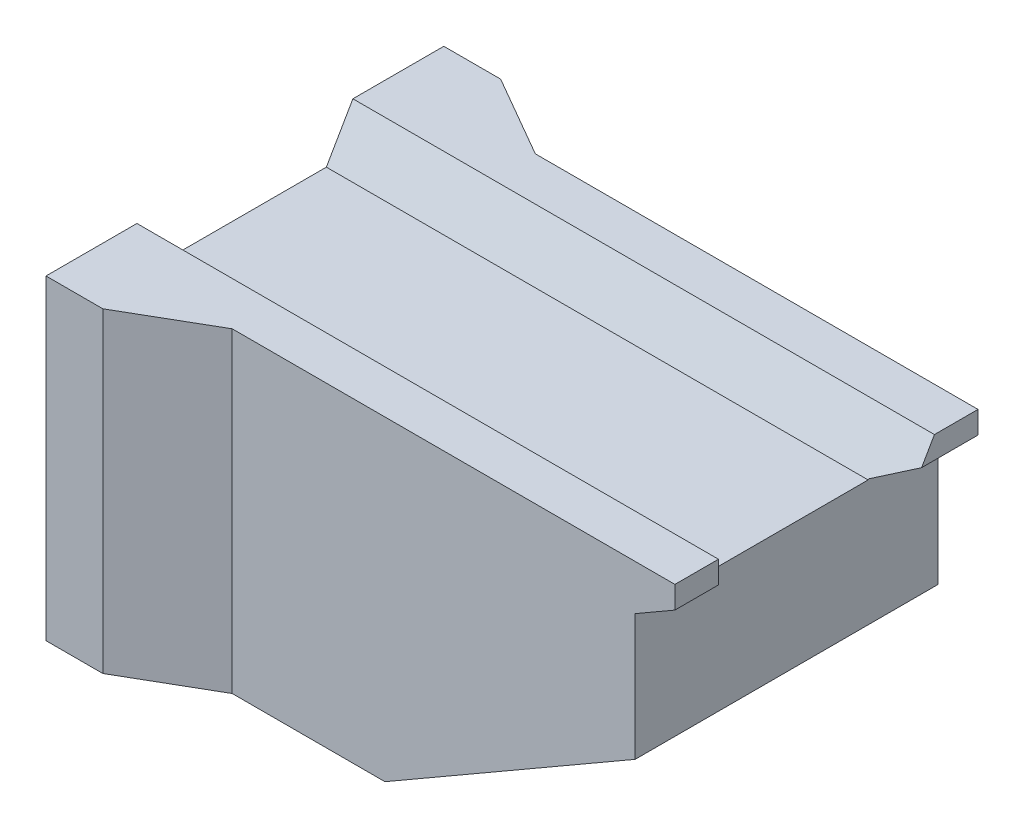
ISO-10303-21;
HEADER;
FILE_DESCRIPTION(('STEP AP214'),'2;1');
FILE_NAME('part.step','',(''),(''),'','','');
FILE_SCHEMA(('AUTOMOTIVE_DESIGN { 1 0 10303 214 1 1 1 1 }'));
ENDSEC;
DATA;
#1=APPLICATION_CONTEXT('core data for automotive mechanical design processes');
#2=APPLICATION_PROTOCOL_DEFINITION('international standard','automotive_design',2000,#1);
#3=PRODUCT_CONTEXT('',#1,'mechanical');
#4=PRODUCT('Part','Part','',(#3));
#5=PRODUCT_RELATED_PRODUCT_CATEGORY('part','',(#4));
#6=PRODUCT_DEFINITION_FORMATION('','',#4);
#7=PRODUCT_DEFINITION_CONTEXT('part definition',#1,'design');
#8=PRODUCT_DEFINITION('design','',#6,#7);
#9=PRODUCT_DEFINITION_SHAPE('','',#8);
#10=(LENGTH_UNIT() NAMED_UNIT(*) SI_UNIT(.MILLI.,.METRE.));
#11=(NAMED_UNIT(*) PLANE_ANGLE_UNIT() SI_UNIT($,.RADIAN.));
#12=(NAMED_UNIT(*) SI_UNIT($,.STERADIAN.) SOLID_ANGLE_UNIT());
#13=UNCERTAINTY_MEASURE_WITH_UNIT(LENGTH_MEASURE(1.E-05),#10,'distance_accuracy_value','');
#14=(GEOMETRIC_REPRESENTATION_CONTEXT(3) GLOBAL_UNCERTAINTY_ASSIGNED_CONTEXT((#13)) GLOBAL_UNIT_ASSIGNED_CONTEXT((#10,
#11,#12)) REPRESENTATION_CONTEXT('',''));
#15=CARTESIAN_POINT('',(0.,0.,0.));
#16=DIRECTION('',(0.,0.,1.));
#17=DIRECTION('',(1.,0.,0.));
#18=AXIS2_PLACEMENT_3D('',#15,#16,#17);
#19=CARTESIAN_POINT('',(350.,-760.,755.));
#20=DIRECTION('',(0.,1.,0.));
#21=DIRECTION('',(0.,0.,1.));
#22=AXIS2_PLACEMENT_3D('',#19,#20,#21);
#23=PLANE('',#22);
#24=DIRECTION('',(0.,0.,1.));
#25=VECTOR('',#24,1.);
#26=CARTESIAN_POINT('',(-264.,-760.,755.));
#27=LINE('',#26,#25);
#28=CARTESIAN_POINT('',(-264.,-760.,527.));
#29=VERTEX_POINT('',#28);
#30=CARTESIAN_POINT('',(-264.,-760.,335.));
#31=VERTEX_POINT('',#30);
#32=EDGE_CURVE('E195',#29,#31,#27,.F.);
#33=ORIENTED_EDGE('',*,*,#32,.F.);
#34=DIRECTION('',(1.,0.,0.));
#35=VECTOR('',#34,1.);
#36=CARTESIAN_POINT('',(350.,-760.,527.));
#37=LINE('',#36,#35);
#38=CARTESIAN_POINT('',(964.,-760.,527.));
#39=VERTEX_POINT('',#38);
#40=EDGE_CURVE('E218',#29,#39,#37,.T.);
#41=ORIENTED_EDGE('',*,*,#40,.T.);
#42=DIRECTION('',(0.,0.,1.));
#43=VECTOR('',#42,1.);
#44=CARTESIAN_POINT('',(964.,-760.,755.));
#45=LINE('',#44,#43);
#46=CARTESIAN_POINT('',(964.,-760.,435.));
#47=VERTEX_POINT('',#46);
#48=EDGE_CURVE('E181',#47,#39,#45,.T.);
#49=ORIENTED_EDGE('',*,*,#48,.F.);
#50=DIRECTION('',(1.,0.,0.));
#51=VECTOR('',#50,1.);
#52=CARTESIAN_POINT('',(496.602540378445,-760.,435.));
#53=LINE('',#52,#51);
#54=CARTESIAN_POINT('',(29.2050807568899,-760.,435.));
#55=VERTEX_POINT('',#54);
#56=EDGE_CURVE('E193',#55,#47,#53,.T.);
#57=ORIENTED_EDGE('',*,*,#56,.F.);
#58=DIRECTION('',(-0.866025403784442,0.,-0.5));
#59=VECTOR('',#58,1.);
#60=CARTESIAN_POINT('',(-57.3974596215552,-760.,385.));
#61=LINE('',#60,#59);
#62=CARTESIAN_POINT('',(-144.,-760.,335.));
#63=VERTEX_POINT('',#62);
#64=EDGE_CURVE('E186',#63,#55,#61,.F.);
#65=ORIENTED_EDGE('',*,*,#64,.F.);
#66=DIRECTION('',(1.,0.,0.));
#67=VECTOR('',#66,1.);
#68=CARTESIAN_POINT('',(-204.,-760.,335.));
#69=LINE('',#68,#67);
#70=EDGE_CURVE('E171',#31,#63,#69,.T.);
#71=ORIENTED_EDGE('',*,*,#70,.F.);
#72=EDGE_LOOP('',(#33,#41,#49,#57,#65,#71));
#73=FACE_BOUND('',#72,.T.);
#74=ADVANCED_FACE('F18',(#73),#23,.T.);
#75=CARTESIAN_POINT('',(964.,-783.5,755.));
#76=DIRECTION('',(1.,0.,0.));
#77=DIRECTION('',(0.,1.,0.));
#78=AXIS2_PLACEMENT_3D('',#75,#76,#77);
#79=PLANE('',#78);
#80=DIRECTION('',(0.,-0.866025403784453,0.499999999999975));
#81=VECTOR('',#80,1.);
#82=CARTESIAN_POINT('',(964.,-760.,527.));
#83=LINE('',#82,#81);
#84=CARTESIAN_POINT('',(964.,-807.,554.135462651908));
#85=VERTEX_POINT('',#84);
#86=EDGE_CURVE('E222',#39,#85,#83,.T.);
#87=ORIENTED_EDGE('',*,*,#86,.T.);
#88=DIRECTION('',(0.,0.,1.));
#89=VECTOR('',#88,1.);
#90=CARTESIAN_POINT('',(964.,-807.,755.));
#91=LINE('',#90,#89);
#92=CARTESIAN_POINT('',(964.,-807.,435.));
#93=VERTEX_POINT('',#92);
#94=EDGE_CURVE('E236',#85,#93,#91,.F.);
#95=ORIENTED_EDGE('',*,*,#94,.T.);
#96=DIRECTION('',(0.,1.,0.));
#97=VECTOR('',#96,1.);
#98=CARTESIAN_POINT('',(964.,-1093.5,435.));
#99=LINE('',#98,#97);
#100=EDGE_CURVE('E245',#47,#93,#99,.F.);
#101=ORIENTED_EDGE('',*,*,#100,.F.);
#102=ORIENTED_EDGE('',*,*,#48,.T.);
#103=EDGE_LOOP('',(#87,#95,#101,#102));
#104=FACE_BOUND('',#103,.T.);
#105=ADVANCED_FACE('F449',(#104),#79,.T.);
#106=CARTESIAN_POINT('',(-204.,-1093.5,335.));
#107=DIRECTION('',(0.,0.,-1.));
#108=DIRECTION('',(0.,1.,0.));
#109=AXIS2_PLACEMENT_3D('',#106,#107,#108);
#110=PLANE('',#109);
#111=DIRECTION('',(0.,-1.,0.));
#112=VECTOR('',#111,1.);
#113=CARTESIAN_POINT('',(-264.,-1093.5,335.));
#114=LINE('',#113,#112);
#115=CARTESIAN_POINT('',(-264.,-1427.,335.));
#116=VERTEX_POINT('',#115);
#117=EDGE_CURVE('E177',#31,#116,#114,.T.);
#118=ORIENTED_EDGE('',*,*,#117,.F.);
#119=ORIENTED_EDGE('',*,*,#70,.T.);
#120=DIRECTION('',(0.,1.,0.));
#121=VECTOR('',#120,1.);
#122=CARTESIAN_POINT('',(-144.,-1093.5,335.));
#123=LINE('',#122,#121);
#124=CARTESIAN_POINT('',(-144.,-1427.,335.));
#125=VERTEX_POINT('',#124);
#126=EDGE_CURVE('E175',#125,#63,#123,.T.);
#127=ORIENTED_EDGE('',*,*,#126,.F.);
#128=DIRECTION('',(1.,0.,0.));
#129=VECTOR('',#128,1.);
#130=CARTESIAN_POINT('',(43.8622518457498,-1427.,335.));
#131=LINE('',#130,#129);
#132=EDGE_CURVE('E270',#116,#125,#131,.T.);
#133=ORIENTED_EDGE('',*,*,#132,.F.);
#134=EDGE_LOOP('',(#118,#119,#127,#133));
#135=FACE_BOUND('',#134,.T.);
#136=ADVANCED_FACE('F173',(#135),#110,.T.);
#137=CARTESIAN_POINT('',(-57.3974596215552,-1093.5,385.));
#138=DIRECTION('',(0.5,0.,-0.866025403784442));
#139=DIRECTION('',(-0.866025403784442,0.,-0.5));
#140=AXIS2_PLACEMENT_3D('',#137,#138,#139);
#141=PLANE('',#140);
#142=ORIENTED_EDGE('',*,*,#64,.T.);
#143=DIRECTION('',(0.,1.,0.));
#144=VECTOR('',#143,1.);
#145=CARTESIAN_POINT('',(29.2050807568898,-1093.5,435.));
#146=LINE('',#145,#144);
#147=CARTESIAN_POINT('',(29.2050807568897,-1427.,435.));
#148=VERTEX_POINT('',#147);
#149=EDGE_CURVE('E240',#148,#55,#146,.T.);
#150=ORIENTED_EDGE('',*,*,#149,.F.);
#151=DIRECTION('',(0.866025403784441,0.,0.5));
#152=VECTOR('',#151,1.);
#153=CARTESIAN_POINT('',(-144.,-1427.,335.));
#154=LINE('',#153,#152);
#155=EDGE_CURVE('E188',#125,#148,#154,.T.);
#156=ORIENTED_EDGE('',*,*,#155,.F.);
#157=ORIENTED_EDGE('',*,*,#126,.T.);
#158=EDGE_LOOP('',(#142,#150,#156,#157));
#159=FACE_BOUND('',#158,.T.);
#160=ADVANCED_FACE('F184',(#159),#141,.T.);
#161=CARTESIAN_POINT('',(-264.,-1093.5,755.));
#162=DIRECTION('',(-1.,0.,0.));
#163=DIRECTION('',(0.,-1.,0.));
#164=AXIS2_PLACEMENT_3D('',#161,#162,#163);
#165=PLANE('',#164);
#166=DIRECTION('',(0.,0.,1.));
#167=VECTOR('',#166,1.);
#168=CARTESIAN_POINT('',(-264.,-760.,755.));
#169=LINE('',#168,#167);
#170=CARTESIAN_POINT('',(-264.,-760.,983.));
#171=VERTEX_POINT('',#170);
#172=CARTESIAN_POINT('',(-264.,-760.,1175.));
#173=VERTEX_POINT('',#172);
#174=EDGE_CURVE('E278',#171,#173,#169,.T.);
#175=ORIENTED_EDGE('',*,*,#174,.F.);
#176=DIRECTION('',(0.,-1.,0.));
#177=VECTOR('',#176,1.);
#178=CARTESIAN_POINT('',(-264.,-1093.5,983.));
#179=LINE('',#178,#177);
#180=CARTESIAN_POINT('',(-264.,-857.,983.));
#181=VERTEX_POINT('',#180);
#182=EDGE_CURVE('E207',#171,#181,#179,.T.);
#183=ORIENTED_EDGE('',*,*,#182,.T.);
#184=DIRECTION('',(0.,0.,1.));
#185=VECTOR('',#184,1.);
#186=CARTESIAN_POINT('',(-264.,-857.,755.));
#187=LINE('',#186,#185);
#188=CARTESIAN_POINT('',(-264.,-857.,583.00297611139));
#189=VERTEX_POINT('',#188);
#190=EDGE_CURVE('E211',#181,#189,#187,.F.);
#191=ORIENTED_EDGE('',*,*,#190,.T.);
#192=DIRECTION('',(0.,0.866025403784453,-0.499999999999975));
#193=VECTOR('',#192,1.);
#194=CARTESIAN_POINT('',(-264.,-857.,583.00297611139));
#195=LINE('',#194,#193);
#196=EDGE_CURVE('E223',#189,#29,#195,.T.);
#197=ORIENTED_EDGE('',*,*,#196,.T.);
#198=ORIENTED_EDGE('',*,*,#32,.T.);
#199=ORIENTED_EDGE('',*,*,#117,.T.);
#200=DIRECTION('',(0.,0.,-1.));
#201=VECTOR('',#200,1.);
#202=CARTESIAN_POINT('',(-264.,-1427.,755.));
#203=LINE('',#202,#201);
#204=CARTESIAN_POINT('',(-264.,-1427.,1175.));
#205=VERTEX_POINT('',#204);
#206=EDGE_CURVE('E266',#205,#116,#203,.T.);
#207=ORIENTED_EDGE('',*,*,#206,.F.);
#208=DIRECTION('',(0.,-1.,0.));
#209=VECTOR('',#208,1.);
#210=CARTESIAN_POINT('',(-264.,-1093.5,1175.));
#211=LINE('',#210,#209);
#212=EDGE_CURVE('E204',#173,#205,#211,.T.);
#213=ORIENTED_EDGE('',*,*,#212,.F.);
#214=EDGE_LOOP('',(#175,#183,#191,#197,#198,#199,#207,#213));
#215=FACE_BOUND('',#214,.T.);
#216=ADVANCED_FACE('F446',(#215),#165,.T.);
#217=CARTESIAN_POINT('',(-204.,-1093.5,1175.));
#218=DIRECTION('',(0.,0.,1.));
#219=DIRECTION('',(0.,-1.,0.));
#220=AXIS2_PLACEMENT_3D('',#217,#218,#219);
#221=PLANE('',#220);
#222=DIRECTION('',(0.,1.,0.));
#223=VECTOR('',#222,1.);
#224=CARTESIAN_POINT('',(-144.,-1093.5,1175.));
#225=LINE('',#224,#223);
#226=CARTESIAN_POINT('',(-144.,-760.,1175.));
#227=VERTEX_POINT('',#226);
#228=CARTESIAN_POINT('',(-144.,-1427.,1175.));
#229=VERTEX_POINT('',#228);
#230=EDGE_CURVE('E262',#227,#229,#225,.F.);
#231=ORIENTED_EDGE('',*,*,#230,.F.);
#232=DIRECTION('',(1.,0.,0.));
#233=VECTOR('',#232,1.);
#234=CARTESIAN_POINT('',(350.,-760.,1175.));
#235=LINE('',#234,#233);
#236=EDGE_CURVE('E289',#173,#227,#235,.T.);
#237=ORIENTED_EDGE('',*,*,#236,.F.);
#238=ORIENTED_EDGE('',*,*,#212,.T.);
#239=DIRECTION('',(1.,0.,0.));
#240=VECTOR('',#239,1.);
#241=CARTESIAN_POINT('',(43.8622518457499,-1427.,1175.));
#242=LINE('',#241,#240);
#243=EDGE_CURVE('E255',#229,#205,#242,.F.);
#244=ORIENTED_EDGE('',*,*,#243,.F.);
#245=EDGE_LOOP('',(#231,#237,#238,#244));
#246=FACE_BOUND('',#245,.T.);
#247=ADVANCED_FACE('F442',(#246),#221,.T.);
#248=CARTESIAN_POINT('',(350.,-808.5,983.));
#249=DIRECTION('',(0.,0.,1.));
#250=DIRECTION('',(0.,-1.,0.));
#251=AXIS2_PLACEMENT_3D('',#248,#249,#250);
#252=PLANE('',#251);
#253=DIRECTION('',(1.,0.,0.));
#254=VECTOR('',#253,1.);
#255=CARTESIAN_POINT('',(350.,-857.,983.));
#256=LINE('',#255,#254);
#257=CARTESIAN_POINT('',(880.,-857.,983.));
#258=VERTEX_POINT('',#257);
#259=EDGE_CURVE('E210',#258,#181,#256,.F.);
#260=ORIENTED_EDGE('',*,*,#259,.T.);
#261=ORIENTED_EDGE('',*,*,#182,.F.);
#262=DIRECTION('',(1.,0.,0.));
#263=VECTOR('',#262,1.);
#264=CARTESIAN_POINT('',(350.,-760.,983.));
#265=LINE('',#264,#263);
#266=CARTESIAN_POINT('',(964.,-760.,983.));
#267=VERTEX_POINT('',#266);
#268=EDGE_CURVE('E281',#267,#171,#265,.F.);
#269=ORIENTED_EDGE('',*,*,#268,.F.);
#270=DIRECTION('',(0.,1.,0.));
#271=VECTOR('',#270,1.);
#272=CARTESIAN_POINT('',(964.,-783.5,983.));
#273=LINE('',#272,#271);
#274=CARTESIAN_POINT('',(964.,-807.,983.));
#275=VERTEX_POINT('',#274);
#276=EDGE_CURVE('E285',#275,#267,#273,.T.);
#277=ORIENTED_EDGE('',*,*,#276,.F.);
#278=DIRECTION('',(-0.866025403784566,-0.49999999999978,0.));
#279=VECTOR('',#278,1.);
#280=CARTESIAN_POINT('',(964.,-807.,983.));
#281=LINE('',#280,#279);
#282=CARTESIAN_POINT('',(880.,-855.4974226119,983.));
#283=VERTEX_POINT('',#282);
#284=EDGE_CURVE('E300',#275,#283,#281,.T.);
#285=ORIENTED_EDGE('',*,*,#284,.T.);
#286=DIRECTION('',(0.,-1.,0.));
#287=VECTOR('',#286,1.);
#288=CARTESIAN_POINT('',(880.,-808.5,983.));
#289=LINE('',#288,#287);
#290=EDGE_CURVE('E323',#283,#258,#289,.T.);
#291=ORIENTED_EDGE('',*,*,#290,.T.);
#292=EDGE_LOOP('',(#260,#261,#269,#277,#285,#291));
#293=FACE_BOUND('',#292,.T.);
#294=ADVANCED_FACE('F423',(#293),#252,.F.);
#295=CARTESIAN_POINT('',(308.,-857.,783.001488055695));
#296=DIRECTION('',(0.,-1.,0.));
#297=DIRECTION('',(0.,0.,-1.));
#298=AXIS2_PLACEMENT_3D('',#295,#296,#297);
#299=PLANE('',#298);
#300=DIRECTION('',(1.,0.,0.));
#301=VECTOR('',#300,1.);
#302=CARTESIAN_POINT('',(308.,-857.,583.00297611139));
#303=LINE('',#302,#301);
#304=CARTESIAN_POINT('',(880.,-857.,583.00297611139));
#305=VERTEX_POINT('',#304);
#306=EDGE_CURVE('E214',#305,#189,#303,.F.);
#307=ORIENTED_EDGE('',*,*,#306,.T.);
#308=ORIENTED_EDGE('',*,*,#190,.F.);
#309=ORIENTED_EDGE('',*,*,#259,.F.);
#310=DIRECTION('',(0.,0.,-1.));
#311=VECTOR('',#310,1.);
#312=CARTESIAN_POINT('',(880.,-857.,783.001488055695));
#313=LINE('',#312,#311);
#314=EDGE_CURVE('E319',#258,#305,#313,.T.);
#315=ORIENTED_EDGE('',*,*,#314,.T.);
#316=EDGE_LOOP('',(#307,#308,#309,#315));
#317=FACE_BOUND('',#316,.T.);
#318=ADVANCED_FACE('F420',(#317),#299,.F.);
#319=CARTESIAN_POINT('',(350.,-808.5,555.001488055695));
#320=DIRECTION('',(0.,-0.499999999999975,-0.866025403784453));
#321=DIRECTION('',(0.,0.866025403784453,-0.499999999999975));
#322=AXIS2_PLACEMENT_3D('',#319,#320,#321);
#323=PLANE('',#322);
#324=ORIENTED_EDGE('',*,*,#40,.F.);
#325=ORIENTED_EDGE('',*,*,#196,.F.);
#326=ORIENTED_EDGE('',*,*,#306,.F.);
#327=DIRECTION('',(0.,0.866025403784453,-0.499999999999975));
#328=VECTOR('',#327,1.);
#329=CARTESIAN_POINT('',(880.,-808.5,555.001488055695));
#330=LINE('',#329,#328);
#331=CARTESIAN_POINT('',(880.,-855.497422611904,582.135462651894));
#332=VERTEX_POINT('',#331);
#333=EDGE_CURVE('E315',#305,#332,#330,.T.);
#334=ORIENTED_EDGE('',*,*,#333,.T.);
#335=DIRECTION('',(0.832050294337911,0.480384461415182,-0.277350098112551));
#336=VECTOR('',#335,1.);
#337=CARTESIAN_POINT('',(880.,-855.497422611908,582.135462651897));
#338=LINE('',#337,#336);
#339=EDGE_CURVE('E232',#332,#85,#338,.T.);
#340=ORIENTED_EDGE('',*,*,#339,.T.);
#341=ORIENTED_EDGE('',*,*,#86,.F.);
#342=EDGE_LOOP('',(#324,#325,#326,#334,#340,#341));
#343=FACE_BOUND('',#342,.T.);
#344=ADVANCED_FACE('F416',(#343),#323,.F.);
#345=CARTESIAN_POINT('',(922.,-831.24871130595,755.));
#346=DIRECTION('',(-0.49999999999978,0.866025403784566,0.));
#347=DIRECTION('',(-0.866025403784566,-0.49999999999978,0.));
#348=AXIS2_PLACEMENT_3D('',#345,#346,#347);
#349=PLANE('',#348);
#350=ORIENTED_EDGE('',*,*,#339,.F.);
#351=DIRECTION('',(0.,0.,1.));
#352=VECTOR('',#351,1.);
#353=CARTESIAN_POINT('',(880.,-855.4974226119,755.));
#354=LINE('',#353,#352);
#355=CARTESIAN_POINT('',(880.,-855.4974226119,435.));
#356=VERTEX_POINT('',#355);
#357=EDGE_CURVE('E311',#332,#356,#354,.F.);
#358=ORIENTED_EDGE('',*,*,#357,.T.);
#359=DIRECTION('',(-0.866025403784566,-0.49999999999978,0.));
#360=VECTOR('',#359,1.);
#361=CARTESIAN_POINT('',(964.,-807.,435.));
#362=LINE('',#361,#360);
#363=EDGE_CURVE('E248',#93,#356,#362,.T.);
#364=ORIENTED_EDGE('',*,*,#363,.F.);
#365=ORIENTED_EDGE('',*,*,#94,.F.);
#366=EDGE_LOOP('',(#350,#358,#364,#365));
#367=FACE_BOUND('',#366,.T.);
#368=ADVANCED_FACE('F411',(#367),#349,.F.);
#369=CARTESIAN_POINT('',(496.602540378445,-1093.5,435.));
#370=DIRECTION('',(0.,0.,-1.));
#371=DIRECTION('',(0.,1.,0.));
#372=AXIS2_PLACEMENT_3D('',#369,#370,#371);
#373=PLANE('',#372);
#374=DIRECTION('',(0.,1.,0.));
#375=VECTOR('',#374,1.);
#376=CARTESIAN_POINT('',(880.,-1093.5,435.));
#377=LINE('',#376,#375);
#378=CARTESIAN_POINT('',(880.,-1122.,435.));
#379=VERTEX_POINT('',#378);
#380=EDGE_CURVE('E306',#356,#379,#377,.F.);
#381=ORIENTED_EDGE('',*,*,#380,.T.);
#382=DIRECTION('',(-0.866025403784436,-0.5,0.));
#383=VECTOR('',#382,1.);
#384=CARTESIAN_POINT('',(880.,-1122.,435.));
#385=LINE('',#384,#383);
#386=CARTESIAN_POINT('',(351.7245036915,-1427.,435.));
#387=VERTEX_POINT('',#386);
#388=EDGE_CURVE('E251',#379,#387,#385,.T.);
#389=ORIENTED_EDGE('',*,*,#388,.T.);
#390=DIRECTION('',(1.,0.,0.));
#391=VECTOR('',#390,1.);
#392=CARTESIAN_POINT('',(43.8622518457498,-1427.,435.));
#393=LINE('',#392,#391);
#394=EDGE_CURVE('E256',#148,#387,#393,.T.);
#395=ORIENTED_EDGE('',*,*,#394,.F.);
#396=ORIENTED_EDGE('',*,*,#149,.T.);
#397=ORIENTED_EDGE('',*,*,#56,.T.);
#398=ORIENTED_EDGE('',*,*,#100,.T.);
#399=ORIENTED_EDGE('',*,*,#363,.T.);
#400=EDGE_LOOP('',(#381,#389,#395,#396,#397,#398,#399));
#401=FACE_BOUND('',#400,.T.);
#402=ADVANCED_FACE('F404',(#401),#373,.T.);
#403=CARTESIAN_POINT('',(615.86225184575,-1274.5,755.));
#404=DIRECTION('',(-0.5,0.866025403784436,0.));
#405=DIRECTION('',(-0.866025403784436,-0.5,0.));
#406=AXIS2_PLACEMENT_3D('',#403,#404,#405);
#407=PLANE('',#406);
#408=ORIENTED_EDGE('',*,*,#388,.F.);
#409=DIRECTION('',(0.,0.,1.));
#410=VECTOR('',#409,1.);
#411=CARTESIAN_POINT('',(880.,-1122.,755.));
#412=LINE('',#411,#410);
#413=CARTESIAN_POINT('',(880.,-1122.,1075.));
#414=VERTEX_POINT('',#413);
#415=EDGE_CURVE('E310',#379,#414,#412,.T.);
#416=ORIENTED_EDGE('',*,*,#415,.T.);
#417=DIRECTION('',(-0.866025403784436,-0.5,0.));
#418=VECTOR('',#417,1.);
#419=CARTESIAN_POINT('',(615.86225184575,-1274.5,1075.));
#420=LINE('',#419,#418);
#421=CARTESIAN_POINT('',(351.7245036915,-1427.,1075.));
#422=VERTEX_POINT('',#421);
#423=EDGE_CURVE('E332',#414,#422,#420,.T.);
#424=ORIENTED_EDGE('',*,*,#423,.T.);
#425=DIRECTION('',(0.,0.,-1.));
#426=VECTOR('',#425,1.);
#427=CARTESIAN_POINT('',(351.7245036915,-1427.,755.));
#428=LINE('',#427,#426);
#429=EDGE_CURVE('E259',#387,#422,#428,.F.);
#430=ORIENTED_EDGE('',*,*,#429,.F.);
#431=EDGE_LOOP('',(#408,#416,#424,#430));
#432=FACE_BOUND('',#431,.T.);
#433=ADVANCED_FACE('F357',(#432),#407,.F.);
#434=CARTESIAN_POINT('',(43.8622518457498,-1427.,755.));
#435=DIRECTION('',(0.,-1.,0.));
#436=DIRECTION('',(0.,0.,-1.));
#437=AXIS2_PLACEMENT_3D('',#434,#435,#436);
#438=PLANE('',#437);
#439=ORIENTED_EDGE('',*,*,#394,.T.);
#440=ORIENTED_EDGE('',*,*,#429,.T.);
#441=DIRECTION('',(1.,0.,0.));
#442=VECTOR('',#441,1.);
#443=CARTESIAN_POINT('',(43.8622518457499,-1427.,1075.));
#444=LINE('',#443,#442);
#445=CARTESIAN_POINT('',(29.2050807568898,-1427.,1075.));
#446=VERTEX_POINT('',#445);
#447=EDGE_CURVE('E348',#422,#446,#444,.F.);
#448=ORIENTED_EDGE('',*,*,#447,.T.);
#449=DIRECTION('',(0.866025403784442,0.,-0.5));
#450=VECTOR('',#449,1.);
#451=CARTESIAN_POINT('',(-57.3974596215552,-1427.,1125.));
#452=LINE('',#451,#450);
#453=EDGE_CURVE('E275',#229,#446,#452,.T.);
#454=ORIENTED_EDGE('',*,*,#453,.F.);
#455=ORIENTED_EDGE('',*,*,#243,.T.);
#456=ORIENTED_EDGE('',*,*,#206,.T.);
#457=ORIENTED_EDGE('',*,*,#132,.T.);
#458=ORIENTED_EDGE('',*,*,#155,.T.);
#459=EDGE_LOOP('',(#439,#440,#448,#454,#455,#456,#457,#458));
#460=FACE_BOUND('',#459,.T.);
#461=ADVANCED_FACE('F401',(#460),#438,.T.);
#462=CARTESIAN_POINT('',(-57.3974596215551,-1093.5,1125.));
#463=DIRECTION('',(0.5,0.,0.866025403784442));
#464=DIRECTION('',(0.866025403784442,0.,-0.5));
#465=AXIS2_PLACEMENT_3D('',#462,#463,#464);
#466=PLANE('',#465);
#467=ORIENTED_EDGE('',*,*,#453,.T.);
#468=DIRECTION('',(0.,1.,0.));
#469=VECTOR('',#468,1.);
#470=CARTESIAN_POINT('',(29.2050807568899,-1093.5,1075.));
#471=LINE('',#470,#469);
#472=CARTESIAN_POINT('',(29.20508075689,-760.,1075.));
#473=VERTEX_POINT('',#472);
#474=EDGE_CURVE('E344',#446,#473,#471,.T.);
#475=ORIENTED_EDGE('',*,*,#474,.T.);
#476=DIRECTION('',(0.866025403784442,0.,-0.5));
#477=VECTOR('',#476,1.);
#478=CARTESIAN_POINT('',(-144.,-760.,1175.));
#479=LINE('',#478,#477);
#480=EDGE_CURVE('E286',#227,#473,#479,.T.);
#481=ORIENTED_EDGE('',*,*,#480,.F.);
#482=ORIENTED_EDGE('',*,*,#230,.T.);
#483=EDGE_LOOP('',(#467,#475,#481,#482));
#484=FACE_BOUND('',#483,.T.);
#485=ADVANCED_FACE('F437',(#484),#466,.T.);
#486=CARTESIAN_POINT('',(350.,-760.,755.));
#487=DIRECTION('',(0.,1.,0.));
#488=DIRECTION('',(0.,0.,1.));
#489=AXIS2_PLACEMENT_3D('',#486,#487,#488);
#490=PLANE('',#489);
#491=DIRECTION('',(0.,0.,1.));
#492=VECTOR('',#491,1.);
#493=CARTESIAN_POINT('',(964.,-760.,755.));
#494=LINE('',#493,#492);
#495=CARTESIAN_POINT('',(964.,-760.,1075.));
#496=VERTEX_POINT('',#495);
#497=EDGE_CURVE('E296',#267,#496,#494,.T.);
#498=ORIENTED_EDGE('',*,*,#497,.F.);
#499=ORIENTED_EDGE('',*,*,#268,.T.);
#500=ORIENTED_EDGE('',*,*,#174,.T.);
#501=ORIENTED_EDGE('',*,*,#236,.T.);
#502=ORIENTED_EDGE('',*,*,#480,.T.);
#503=DIRECTION('',(1.,0.,0.));
#504=VECTOR('',#503,1.);
#505=CARTESIAN_POINT('',(350.,-760.,1075.));
#506=LINE('',#505,#504);
#507=EDGE_CURVE('E340',#473,#496,#506,.T.);
#508=ORIENTED_EDGE('',*,*,#507,.T.);
#509=EDGE_LOOP('',(#498,#499,#500,#501,#502,#508));
#510=FACE_BOUND('',#509,.T.);
#511=ADVANCED_FACE('F433',(#510),#490,.T.);
#512=CARTESIAN_POINT('',(964.,-783.5,755.));
#513=DIRECTION('',(1.,0.,0.));
#514=DIRECTION('',(0.,1.,0.));
#515=AXIS2_PLACEMENT_3D('',#512,#513,#514);
#516=PLANE('',#515);
#517=DIRECTION('',(0.,1.,0.));
#518=VECTOR('',#517,1.);
#519=CARTESIAN_POINT('',(964.,-783.5,1075.));
#520=LINE('',#519,#518);
#521=CARTESIAN_POINT('',(964.,-807.,1075.));
#522=VERTEX_POINT('',#521);
#523=EDGE_CURVE('E336',#496,#522,#520,.F.);
#524=ORIENTED_EDGE('',*,*,#523,.T.);
#525=DIRECTION('',(0.,0.,1.));
#526=VECTOR('',#525,1.);
#527=CARTESIAN_POINT('',(964.,-807.,755.));
#528=LINE('',#527,#526);
#529=EDGE_CURVE('E299',#522,#275,#528,.F.);
#530=ORIENTED_EDGE('',*,*,#529,.T.);
#531=ORIENTED_EDGE('',*,*,#276,.T.);
#532=ORIENTED_EDGE('',*,*,#497,.T.);
#533=EDGE_LOOP('',(#524,#530,#531,#532));
#534=FACE_BOUND('',#533,.T.);
#535=ADVANCED_FACE('F430',(#534),#516,.T.);
#536=CARTESIAN_POINT('',(922.,-831.24871130595,755.));
#537=DIRECTION('',(-0.49999999999978,0.866025403784566,0.));
#538=DIRECTION('',(-0.866025403784566,-0.49999999999978,0.));
#539=AXIS2_PLACEMENT_3D('',#536,#537,#538);
#540=PLANE('',#539);
#541=ORIENTED_EDGE('',*,*,#284,.F.);
#542=ORIENTED_EDGE('',*,*,#529,.F.);
#543=DIRECTION('',(-0.866025403784566,-0.49999999999978,0.));
#544=VECTOR('',#543,1.);
#545=CARTESIAN_POINT('',(922.,-831.24871130595,1075.));
#546=LINE('',#545,#544);
#547=CARTESIAN_POINT('',(880.,-855.4974226119,1075.));
#548=VERTEX_POINT('',#547);
#549=EDGE_CURVE('E28',#522,#548,#546,.T.);
#550=ORIENTED_EDGE('',*,*,#549,.T.);
#551=DIRECTION('',(0.,0.,1.));
#552=VECTOR('',#551,1.);
#553=CARTESIAN_POINT('',(880.,-855.4974226119,755.));
#554=LINE('',#553,#552);
#555=EDGE_CURVE('E38',#548,#283,#554,.F.);
#556=ORIENTED_EDGE('',*,*,#555,.T.);
#557=EDGE_LOOP('',(#541,#542,#550,#556));
#558=FACE_BOUND('',#557,.T.);
#559=ADVANCED_FACE('F427',(#558),#540,.F.);
#560=CARTESIAN_POINT('',(880.,-988.74871130595,755.));
#561=DIRECTION('',(-1.,0.,0.));
#562=DIRECTION('',(0.,-1.,0.));
#563=AXIS2_PLACEMENT_3D('',#560,#561,#562);
#564=PLANE('',#563);
#565=ORIENTED_EDGE('',*,*,#380,.F.);
#566=ORIENTED_EDGE('',*,*,#357,.F.);
#567=ORIENTED_EDGE('',*,*,#333,.F.);
#568=ORIENTED_EDGE('',*,*,#314,.F.);
#569=ORIENTED_EDGE('',*,*,#290,.F.);
#570=ORIENTED_EDGE('',*,*,#555,.F.);
#571=DIRECTION('',(0.,-1.,0.));
#572=VECTOR('',#571,1.);
#573=CARTESIAN_POINT('',(880.,-988.74871130595,1075.));
#574=LINE('',#573,#572);
#575=EDGE_CURVE('E11',#548,#414,#574,.T.);
#576=ORIENTED_EDGE('',*,*,#575,.T.);
#577=ORIENTED_EDGE('',*,*,#415,.F.);
#578=EDGE_LOOP('',(#565,#566,#567,#568,#569,#570,#576,#577));
#579=FACE_BOUND('',#578,.T.);
#580=ADVANCED_FACE('F406',(#579),#564,.F.);
#581=CARTESIAN_POINT('',(496.602540378445,-1093.5,1075.));
#582=DIRECTION('',(0.,0.,-1.));
#583=DIRECTION('',(0.,1.,0.));
#584=AXIS2_PLACEMENT_3D('',#581,#582,#583);
#585=PLANE('',#584);
#586=ORIENTED_EDGE('',*,*,#549,.F.);
#587=ORIENTED_EDGE('',*,*,#523,.F.);
#588=ORIENTED_EDGE('',*,*,#507,.F.);
#589=ORIENTED_EDGE('',*,*,#474,.F.);
#590=ORIENTED_EDGE('',*,*,#447,.F.);
#591=ORIENTED_EDGE('',*,*,#423,.F.);
#592=ORIENTED_EDGE('',*,*,#575,.F.);
#593=EDGE_LOOP('',(#586,#587,#588,#589,#590,#591,#592));
#594=FACE_BOUND('',#593,.T.);
#595=ADVANCED_FACE('F20',(#594),#585,.F.);
#596=CLOSED_SHELL('',(#74,#105,#136,#160,#216,#247,#294,#318,#344,#368,#402,#433,#461,#485,#511,
#535,#559,#580,#595));
#597=MANIFOLD_SOLID_BREP('B1',#596);
#598=ADVANCED_BREP_SHAPE_REPRESENTATION('',(#18,#597),#14);
#599=SHAPE_DEFINITION_REPRESENTATION(#9,#598);
ENDSEC;
END-ISO-10303-21;
